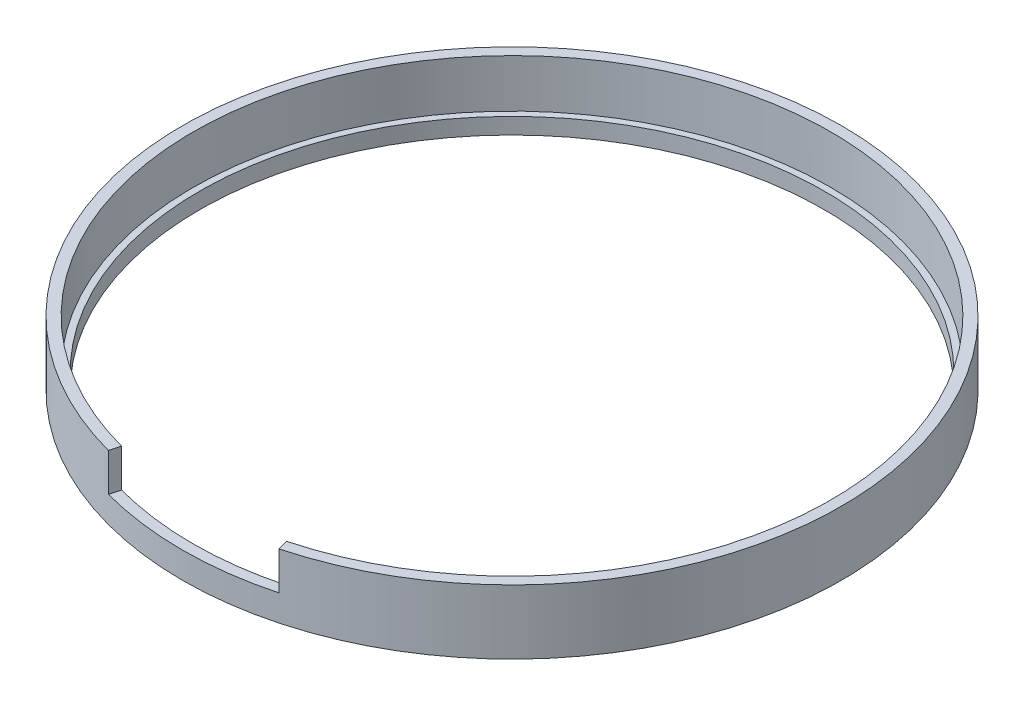
ISO-10303-21;
HEADER;
FILE_DESCRIPTION(('STEP AP214'),'2;1');
FILE_NAME('part.step','',(''),(''),'','','');
FILE_SCHEMA(('AUTOMOTIVE_DESIGN { 1 0 10303 214 1 1 1 1 }'));
ENDSEC;
DATA;
#1=APPLICATION_CONTEXT('core data for automotive mechanical design processes');
#2=APPLICATION_PROTOCOL_DEFINITION('international standard','automotive_design',2000,#1);
#3=PRODUCT_CONTEXT('',#1,'mechanical');
#4=PRODUCT('Part','Part','',(#3));
#5=PRODUCT_RELATED_PRODUCT_CATEGORY('part','',(#4));
#6=PRODUCT_DEFINITION_FORMATION('','',#4);
#7=PRODUCT_DEFINITION_CONTEXT('part definition',#1,'design');
#8=PRODUCT_DEFINITION('design','',#6,#7);
#9=PRODUCT_DEFINITION_SHAPE('','',#8);
#10=(LENGTH_UNIT() NAMED_UNIT(*) SI_UNIT(.MILLI.,.METRE.));
#11=(NAMED_UNIT(*) PLANE_ANGLE_UNIT() SI_UNIT($,.RADIAN.));
#12=(NAMED_UNIT(*) SI_UNIT($,.STERADIAN.) SOLID_ANGLE_UNIT());
#13=UNCERTAINTY_MEASURE_WITH_UNIT(LENGTH_MEASURE(1.E-05),#10,'distance_accuracy_value','');
#14=(GEOMETRIC_REPRESENTATION_CONTEXT(3) GLOBAL_UNCERTAINTY_ASSIGNED_CONTEXT((#13)) GLOBAL_UNIT_ASSIGNED_CONTEXT((#10,
#11,#12)) REPRESENTATION_CONTEXT('',''));
#15=CARTESIAN_POINT('',(0.,0.,0.));
#16=DIRECTION('',(0.,0.,1.));
#17=DIRECTION('',(1.,0.,0.));
#18=AXIS2_PLACEMENT_3D('',#15,#16,#17);
#19=CARTESIAN_POINT('',(0.,39.,0.));
#20=DIRECTION('',(0.,1.,0.));
#21=DIRECTION('',(0.,0.,1.));
#22=AXIS2_PLACEMENT_3D('',#19,#20,#21);
#23=PLANE('',#22);
#24=DIRECTION('',(-0.258819045102521,0.,0.965925826289068));
#25=VECTOR('',#24,1.);
#26=CARTESIAN_POINT('',(-50.0814852273379,39.,186.906647386935));
#27=LINE('',#26,#25);
#28=CARTESIAN_POINT('',(-50.0814852273379,39.,186.906647386935));
#29=VERTEX_POINT('',#28);
#30=CARTESIAN_POINT('',(-51.7638090205043,39.,193.185165257814));
#31=VERTEX_POINT('',#30);
#32=EDGE_CURVE('E107',#29,#31,#27,.T.);
#33=ORIENTED_EDGE('',*,*,#32,.F.);
#34=CARTESIAN_POINT('',(0.,39.,0.));
#35=DIRECTION('',(0.,1.,0.));
#36=DIRECTION('',(0.,0.,1.));
#37=AXIS2_PLACEMENT_3D('',#34,#35,#36);
#38=CIRCLE('',#37,193.5);
#39=CARTESIAN_POINT('',(50.0814852273379,39.,186.906647386935));
#40=VERTEX_POINT('',#39);
#41=EDGE_CURVE('E114',#40,#29,#38,.T.);
#42=ORIENTED_EDGE('',*,*,#41,.F.);
#43=DIRECTION('',(-0.258819045102522,0.,-0.965925826289068));
#44=VECTOR('',#43,1.);
#45=CARTESIAN_POINT('',(50.0814852273379,39.,186.906647386935));
#46=LINE('',#45,#44);
#47=CARTESIAN_POINT('',(51.7638090205043,39.,193.185165257814));
#48=VERTEX_POINT('',#47);
#49=EDGE_CURVE('E101',#48,#40,#46,.T.);
#50=ORIENTED_EDGE('',*,*,#49,.F.);
#51=CARTESIAN_POINT('',(0.,39.,0.));
#52=DIRECTION('',(0.,1.,0.));
#53=DIRECTION('',(0.,0.,1.));
#54=AXIS2_PLACEMENT_3D('',#51,#52,#53);
#55=CIRCLE('',#54,200.);
#56=EDGE_CURVE('E66',#48,#31,#55,.T.);
#57=ORIENTED_EDGE('',*,*,#56,.T.);
#58=EDGE_LOOP('',(#33,#42,#50,#57));
#59=FACE_BOUND('',#58,.T.);
#60=ADVANCED_FACE('F58',(#59),#23,.T.);
#61=CARTESIAN_POINT('',(0.,0.,0.));
#62=DIRECTION('',(0.,1.,0.));
#63=DIRECTION('',(0.,0.,1.));
#64=AXIS2_PLACEMENT_3D('',#61,#62,#63);
#65=PLANE('',#64);
#66=CARTESIAN_POINT('',(0.,0.,0.));
#67=DIRECTION('',(0.,1.,0.));
#68=DIRECTION('',(0.,0.,1.));
#69=AXIS2_PLACEMENT_3D('',#66,#67,#68);
#70=CIRCLE('',#69,200.);
#71=CARTESIAN_POINT('',(0.,0.,200.));
#72=VERTEX_POINT('',#71);
#73=EDGE_CURVE('E119',#72,#72,#70,.T.);
#74=ORIENTED_EDGE('',*,*,#73,.F.);
#75=EDGE_LOOP('',(#74));
#76=FACE_BOUND('',#75,.T.);
#77=CARTESIAN_POINT('',(0.,0.,0.));
#78=DIRECTION('',(0.,1.,0.));
#79=DIRECTION('',(0.,0.,1.));
#80=AXIS2_PLACEMENT_3D('',#77,#78,#79);
#81=CIRCLE('',#80,189.6);
#82=CARTESIAN_POINT('',(0.,0.,189.6));
#83=VERTEX_POINT('',#82);
#84=EDGE_CURVE('E125',#83,#83,#81,.T.);
#85=ORIENTED_EDGE('',*,*,#84,.T.);
#86=EDGE_LOOP('',(#85));
#87=FACE_BOUND('',#86,.T.);
#88=ADVANCED_FACE('F160',(#76,#87),#65,.F.);
#89=CARTESIAN_POINT('',(0.,39.,0.));
#90=DIRECTION('',(0.,-1.,0.));
#91=DIRECTION('',(0.,0.,-1.));
#92=AXIS2_PLACEMENT_3D('',#89,#90,#91);
#93=CYLINDRICAL_SURFACE('',#92,200.);
#94=CARTESIAN_POINT('',(0.,15.9,0.));
#95=DIRECTION('',(0.,1.,0.));
#96=DIRECTION('',(0.,0.,1.));
#97=AXIS2_PLACEMENT_3D('',#94,#95,#96);
#98=CIRCLE('',#97,200.);
#99=CARTESIAN_POINT('',(51.7638090205043,15.9,193.185165257814));
#100=VERTEX_POINT('',#99);
#101=CARTESIAN_POINT('',(-51.7638090205043,15.9,193.185165257814));
#102=VERTEX_POINT('',#101);
#103=EDGE_CURVE('E130',#100,#102,#98,.F.);
#104=ORIENTED_EDGE('',*,*,#103,.T.);
#105=DIRECTION('',(0.,1.,0.));
#106=VECTOR('',#105,1.);
#107=CARTESIAN_POINT('',(-51.7638090205043,-88.4523051010136,193.185165257814));
#108=LINE('',#107,#106);
#109=EDGE_CURVE('E118',#102,#31,#108,.T.);
#110=ORIENTED_EDGE('',*,*,#109,.T.);
#111=ORIENTED_EDGE('',*,*,#56,.F.);
#112=DIRECTION('',(0.,1.,0.));
#113=VECTOR('',#112,1.);
#114=CARTESIAN_POINT('',(51.7638090205043,-88.4523051010136,193.185165257814));
#115=LINE('',#114,#113);
#116=EDGE_CURVE('E98',#100,#48,#115,.T.);
#117=ORIENTED_EDGE('',*,*,#116,.F.);
#118=EDGE_LOOP('',(#104,#110,#111,#117));
#119=FACE_BOUND('',#118,.T.);
#120=ORIENTED_EDGE('',*,*,#73,.T.);
#121=EDGE_LOOP('',(#120));
#122=FACE_BOUND('',#121,.T.);
#123=ADVANCED_FACE('F60',(#119,#122),#93,.T.);
#124=CARTESIAN_POINT('',(0.,39.,0.));
#125=DIRECTION('',(0.,-1.,0.));
#126=DIRECTION('',(0.,0.,-1.));
#127=AXIS2_PLACEMENT_3D('',#124,#125,#126);
#128=CYLINDRICAL_SURFACE('',#127,193.5);
#129=DIRECTION('',(0.,1.,0.));
#130=VECTOR('',#129,1.);
#131=CARTESIAN_POINT('',(-50.0814852273379,-88.4523051010136,186.906647386935));
#132=LINE('',#131,#130);
#133=CARTESIAN_POINT('',(-50.0814852273379,15.9,186.906647386935));
#134=VERTEX_POINT('',#133);
#135=EDGE_CURVE('E133',#134,#29,#132,.T.);
#136=ORIENTED_EDGE('',*,*,#135,.F.);
#137=CARTESIAN_POINT('',(0.,15.9,0.));
#138=DIRECTION('',(0.,1.,0.));
#139=DIRECTION('',(0.,0.,1.));
#140=AXIS2_PLACEMENT_3D('',#137,#138,#139);
#141=CIRCLE('',#140,193.5);
#142=CARTESIAN_POINT('',(50.0814852273379,15.9,186.906647386935));
#143=VERTEX_POINT('',#142);
#144=EDGE_CURVE('E136',#134,#143,#141,.T.);
#145=ORIENTED_EDGE('',*,*,#144,.T.);
#146=DIRECTION('',(0.,1.,0.));
#147=VECTOR('',#146,1.);
#148=CARTESIAN_POINT('',(50.0814852273379,-88.4523051010136,186.906647386935));
#149=LINE('',#148,#147);
#150=EDGE_CURVE('E106',#143,#40,#149,.T.);
#151=ORIENTED_EDGE('',*,*,#150,.T.);
#152=ORIENTED_EDGE('',*,*,#41,.T.);
#153=EDGE_LOOP('',(#136,#145,#151,#152));
#154=FACE_BOUND('',#153,.T.);
#155=CARTESIAN_POINT('',(0.,9.8,0.));
#156=DIRECTION('',(0.,1.,0.));
#157=DIRECTION('',(0.,0.,1.));
#158=AXIS2_PLACEMENT_3D('',#155,#156,#157);
#159=CIRCLE('',#158,193.5);
#160=CARTESIAN_POINT('',(0.,9.8,193.5));
#161=VERTEX_POINT('',#160);
#162=EDGE_CURVE('E14',#161,#161,#159,.T.);
#163=ORIENTED_EDGE('',*,*,#162,.F.);
#164=EDGE_LOOP('',(#163));
#165=FACE_BOUND('',#164,.T.);
#166=ADVANCED_FACE('F143',(#154,#165),#128,.F.);
#167=CARTESIAN_POINT('',(0.,9.8,0.));
#168=DIRECTION('',(0.,1.,0.));
#169=DIRECTION('',(0.,0.,1.));
#170=AXIS2_PLACEMENT_3D('',#167,#168,#169);
#171=PLANE('',#170);
#172=ORIENTED_EDGE('',*,*,#162,.T.);
#173=EDGE_LOOP('',(#172));
#174=FACE_BOUND('',#173,.T.);
#175=CARTESIAN_POINT('',(0.,9.8,0.));
#176=DIRECTION('',(0.,1.,0.));
#177=DIRECTION('',(0.,0.,1.));
#178=AXIS2_PLACEMENT_3D('',#175,#176,#177);
#179=CIRCLE('',#178,189.6);
#180=CARTESIAN_POINT('',(0.,9.8,189.6));
#181=VERTEX_POINT('',#180);
#182=EDGE_CURVE('E124',#181,#181,#179,.T.);
#183=ORIENTED_EDGE('',*,*,#182,.F.);
#184=EDGE_LOOP('',(#183));
#185=FACE_BOUND('',#184,.T.);
#186=ADVANCED_FACE('F155',(#174,#185),#171,.T.);
#187=CARTESIAN_POINT('',(0.,9.8,0.));
#188=DIRECTION('',(0.,-1.,0.));
#189=DIRECTION('',(0.,0.,-1.));
#190=AXIS2_PLACEMENT_3D('',#187,#188,#189);
#191=CYLINDRICAL_SURFACE('',#190,189.6);
#192=ORIENTED_EDGE('',*,*,#182,.T.);
#193=EDGE_LOOP('',(#192));
#194=FACE_BOUND('',#193,.T.);
#195=ORIENTED_EDGE('',*,*,#84,.F.);
#196=EDGE_LOOP('',(#195));
#197=FACE_BOUND('',#196,.T.);
#198=ADVANCED_FACE('F148',(#194,#197),#191,.F.);
#199=CARTESIAN_POINT('',(-50.0814852273379,-88.4523051010136,186.906647386935));
#200=DIRECTION('',(-0.965925826289068,0.,-0.258819045102521));
#201=DIRECTION('',(-0.258819045102521,0.,0.965925826289068));
#202=AXIS2_PLACEMENT_3D('',#199,#200,#201);
#203=PLANE('',#202);
#204=DIRECTION('',(0.258819045102521,0.,-0.965925826289068));
#205=VECTOR('',#204,1.);
#206=CARTESIAN_POINT('',(-50.0814852273379,15.9,186.906647386935));
#207=LINE('',#206,#205);
#208=EDGE_CURVE('E82',#102,#134,#207,.T.);
#209=ORIENTED_EDGE('',*,*,#208,.T.);
#210=ORIENTED_EDGE('',*,*,#135,.T.);
#211=ORIENTED_EDGE('',*,*,#32,.T.);
#212=ORIENTED_EDGE('',*,*,#109,.F.);
#213=EDGE_LOOP('',(#209,#210,#211,#212));
#214=FACE_BOUND('',#213,.T.);
#215=ADVANCED_FACE('F146',(#214),#203,.F.);
#216=CARTESIAN_POINT('',(50.0814852273379,-88.4523051010136,186.906647386935));
#217=DIRECTION('',(0.965925826289068,0.,-0.258819045102522));
#218=DIRECTION('',(-0.258819045102522,0.,-0.965925826289068));
#219=AXIS2_PLACEMENT_3D('',#216,#217,#218);
#220=PLANE('',#219);
#221=DIRECTION('',(0.258819045102522,0.,0.965925826289068));
#222=VECTOR('',#221,1.);
#223=CARTESIAN_POINT('',(50.0814852273379,15.9,186.906647386935));
#224=LINE('',#223,#222);
#225=EDGE_CURVE('E73',#143,#100,#224,.T.);
#226=ORIENTED_EDGE('',*,*,#225,.T.);
#227=ORIENTED_EDGE('',*,*,#116,.T.);
#228=ORIENTED_EDGE('',*,*,#49,.T.);
#229=ORIENTED_EDGE('',*,*,#150,.F.);
#230=EDGE_LOOP('',(#226,#227,#228,#229));
#231=FACE_BOUND('',#230,.T.);
#232=ADVANCED_FACE('F100',(#231),#220,.F.);
#233=CARTESIAN_POINT('',(0.,15.9,0.));
#234=DIRECTION('',(0.,1.,0.));
#235=DIRECTION('',(0.468785155018629,0.,0.883312220245005));
#236=AXIS2_PLACEMENT_3D('',#233,#234,#235);
#237=PLANE('',#236);
#238=ORIENTED_EDGE('',*,*,#103,.F.);
#239=ORIENTED_EDGE('',*,*,#225,.F.);
#240=ORIENTED_EDGE('',*,*,#144,.F.);
#241=ORIENTED_EDGE('',*,*,#208,.F.);
#242=EDGE_LOOP('',(#238,#239,#240,#241));
#243=FACE_BOUND('',#242,.T.);
#244=ADVANCED_FACE('F145',(#243),#237,.T.);
#245=CLOSED_SHELL('',(#60,#88,#123,#166,#186,#198,#215,#232,#244));
#246=MANIFOLD_SOLID_BREP('B2',#245);
#247=ADVANCED_BREP_SHAPE_REPRESENTATION('',(#18,#246),#14);
#248=SHAPE_DEFINITION_REPRESENTATION(#9,#247);
ENDSEC;
END-ISO-10303-21;
